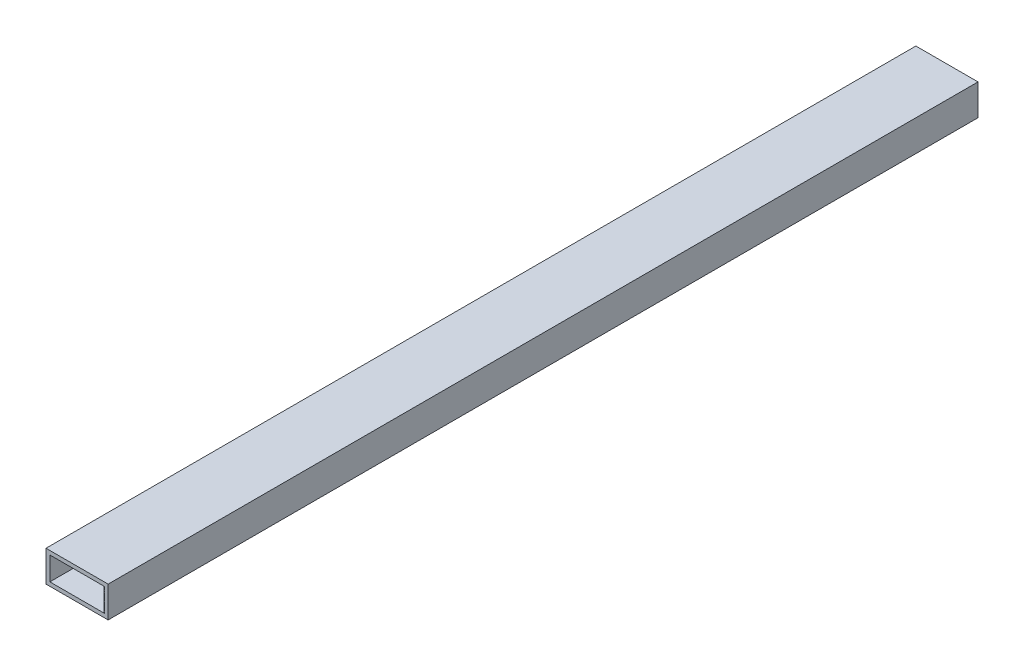
ISO-10303-21;
HEADER;
FILE_DESCRIPTION(('STEP AP214'),'2;1');
FILE_NAME('part.step','',(''),(''),'','','');
FILE_SCHEMA(('AUTOMOTIVE_DESIGN { 1 0 10303 214 1 1 1 1 }'));
ENDSEC;
DATA;
#1=APPLICATION_CONTEXT('core data for automotive mechanical design processes');
#2=APPLICATION_PROTOCOL_DEFINITION('international standard','automotive_design',2000,#1);
#3=PRODUCT_CONTEXT('',#1,'mechanical');
#4=PRODUCT('Part','Part','',(#3));
#5=PRODUCT_RELATED_PRODUCT_CATEGORY('part','',(#4));
#6=PRODUCT_DEFINITION_FORMATION('','',#4);
#7=PRODUCT_DEFINITION_CONTEXT('part definition',#1,'design');
#8=PRODUCT_DEFINITION('design','',#6,#7);
#9=PRODUCT_DEFINITION_SHAPE('','',#8);
#10=(LENGTH_UNIT() NAMED_UNIT(*) SI_UNIT(.MILLI.,.METRE.));
#11=(NAMED_UNIT(*) PLANE_ANGLE_UNIT() SI_UNIT($,.RADIAN.));
#12=(NAMED_UNIT(*) SI_UNIT($,.STERADIAN.) SOLID_ANGLE_UNIT());
#13=UNCERTAINTY_MEASURE_WITH_UNIT(LENGTH_MEASURE(1.E-05),#10,'distance_accuracy_value','');
#14=(GEOMETRIC_REPRESENTATION_CONTEXT(3) GLOBAL_UNCERTAINTY_ASSIGNED_CONTEXT((#13)) GLOBAL_UNIT_ASSIGNED_CONTEXT((#10,
#11,#12)) REPRESENTATION_CONTEXT('',''));
#15=CARTESIAN_POINT('',(0.,0.,0.));
#16=DIRECTION('',(0.,0.,1.));
#17=DIRECTION('',(1.,0.,0.));
#18=AXIS2_PLACEMENT_3D('',#15,#16,#17);
#19=CARTESIAN_POINT('',(25.4,12.7,711.2));
#20=DIRECTION('',(-1.,0.,0.));
#21=DIRECTION('',(0.,0.,1.));
#22=AXIS2_PLACEMENT_3D('',#19,#20,#21);
#23=PLANE('',#22);
#24=DIRECTION('',(0.,1.,0.));
#25=VECTOR('',#24,1.);
#26=CARTESIAN_POINT('',(25.4,12.7,0.));
#27=LINE('',#26,#25);
#28=CARTESIAN_POINT('',(25.4,-12.7,0.));
#29=VERTEX_POINT('',#28);
#30=CARTESIAN_POINT('',(25.4,12.7,0.));
#31=VERTEX_POINT('',#30);
#32=EDGE_CURVE('E145',#29,#31,#27,.T.);
#33=ORIENTED_EDGE('',*,*,#32,.T.);
#34=DIRECTION('',(0.,0.,-1.));
#35=VECTOR('',#34,1.);
#36=CARTESIAN_POINT('',(25.4,12.7,711.2));
#37=LINE('',#36,#35);
#38=CARTESIAN_POINT('',(25.4,12.7,711.2));
#39=VERTEX_POINT('',#38);
#40=EDGE_CURVE('E11',#39,#31,#37,.T.);
#41=ORIENTED_EDGE('',*,*,#40,.F.);
#42=DIRECTION('',(0.,1.,0.));
#43=VECTOR('',#42,1.);
#44=CARTESIAN_POINT('',(25.4,12.7,711.2));
#45=LINE('',#44,#43);
#46=CARTESIAN_POINT('',(25.4,-12.7,711.2));
#47=VERTEX_POINT('',#46);
#48=EDGE_CURVE('E134',#47,#39,#45,.T.);
#49=ORIENTED_EDGE('',*,*,#48,.F.);
#50=DIRECTION('',(0.,0.,-1.));
#51=VECTOR('',#50,1.);
#52=CARTESIAN_POINT('',(25.4,-12.7,711.2));
#53=LINE('',#52,#51);
#54=EDGE_CURVE('E144',#47,#29,#53,.T.);
#55=ORIENTED_EDGE('',*,*,#54,.T.);
#56=EDGE_LOOP('',(#33,#41,#49,#55));
#57=FACE_BOUND('',#56,.T.);
#58=ADVANCED_FACE('F37',(#57),#23,.F.);
#59=CARTESIAN_POINT('',(-25.4,12.7,711.2));
#60=DIRECTION('',(0.,-1.,0.));
#61=DIRECTION('',(0.,0.,-1.));
#62=AXIS2_PLACEMENT_3D('',#59,#60,#61);
#63=PLANE('',#62);
#64=DIRECTION('',(-1.,0.,0.));
#65=VECTOR('',#64,1.);
#66=CARTESIAN_POINT('',(-25.4,12.7,0.));
#67=LINE('',#66,#65);
#68=CARTESIAN_POINT('',(-25.4,12.7,0.));
#69=VERTEX_POINT('',#68);
#70=EDGE_CURVE('E148',#31,#69,#67,.T.);
#71=ORIENTED_EDGE('',*,*,#70,.T.);
#72=DIRECTION('',(0.,0.,-1.));
#73=VECTOR('',#72,1.);
#74=CARTESIAN_POINT('',(-25.4,12.7,711.2));
#75=LINE('',#74,#73);
#76=CARTESIAN_POINT('',(-25.4,12.7,711.2));
#77=VERTEX_POINT('',#76);
#78=EDGE_CURVE('E44',#77,#69,#75,.T.);
#79=ORIENTED_EDGE('',*,*,#78,.F.);
#80=DIRECTION('',(-1.,0.,0.));
#81=VECTOR('',#80,1.);
#82=CARTESIAN_POINT('',(-25.4,12.7,711.2));
#83=LINE('',#82,#81);
#84=EDGE_CURVE('E137',#39,#77,#83,.T.);
#85=ORIENTED_EDGE('',*,*,#84,.F.);
#86=ORIENTED_EDGE('',*,*,#40,.T.);
#87=EDGE_LOOP('',(#71,#79,#85,#86));
#88=FACE_BOUND('',#87,.T.);
#89=ADVANCED_FACE('F176',(#88),#63,.F.);
#90=CARTESIAN_POINT('',(-25.4,12.7,711.2));
#91=DIRECTION('',(1.,0.,0.));
#92=DIRECTION('',(0.,0.,-1.));
#93=AXIS2_PLACEMENT_3D('',#90,#91,#92);
#94=PLANE('',#93);
#95=DIRECTION('',(0.,-1.,0.));
#96=VECTOR('',#95,1.);
#97=CARTESIAN_POINT('',(-25.4,12.7,0.));
#98=LINE('',#97,#96);
#99=CARTESIAN_POINT('',(-25.4,-12.7,0.));
#100=VERTEX_POINT('',#99);
#101=EDGE_CURVE('E150',#69,#100,#98,.T.);
#102=ORIENTED_EDGE('',*,*,#101,.T.);
#103=DIRECTION('',(0.,0.,-1.));
#104=VECTOR('',#103,1.);
#105=CARTESIAN_POINT('',(-25.4,-12.7,711.2));
#106=LINE('',#105,#104);
#107=CARTESIAN_POINT('',(-25.4,-12.7,711.2));
#108=VERTEX_POINT('',#107);
#109=EDGE_CURVE('E155',#108,#100,#106,.T.);
#110=ORIENTED_EDGE('',*,*,#109,.F.);
#111=DIRECTION('',(0.,-1.,0.));
#112=VECTOR('',#111,1.);
#113=CARTESIAN_POINT('',(-25.4,12.7,711.2));
#114=LINE('',#113,#112);
#115=EDGE_CURVE('E140',#77,#108,#114,.T.);
#116=ORIENTED_EDGE('',*,*,#115,.F.);
#117=ORIENTED_EDGE('',*,*,#78,.T.);
#118=EDGE_LOOP('',(#102,#110,#116,#117));
#119=FACE_BOUND('',#118,.T.);
#120=ADVANCED_FACE('F162',(#119),#94,.F.);
#121=CARTESIAN_POINT('',(-25.4,-12.7,711.2));
#122=DIRECTION('',(0.,1.,0.));
#123=DIRECTION('',(0.,0.,1.));
#124=AXIS2_PLACEMENT_3D('',#121,#122,#123);
#125=PLANE('',#124);
#126=DIRECTION('',(1.,0.,0.));
#127=VECTOR('',#126,1.);
#128=CARTESIAN_POINT('',(-25.4,-12.7,0.));
#129=LINE('',#128,#127);
#130=EDGE_CURVE('E138',#100,#29,#129,.T.);
#131=ORIENTED_EDGE('',*,*,#130,.T.);
#132=ORIENTED_EDGE('',*,*,#54,.F.);
#133=DIRECTION('',(1.,0.,0.));
#134=VECTOR('',#133,1.);
#135=CARTESIAN_POINT('',(-25.4,-12.7,711.2));
#136=LINE('',#135,#134);
#137=EDGE_CURVE('E142',#108,#47,#136,.T.);
#138=ORIENTED_EDGE('',*,*,#137,.F.);
#139=ORIENTED_EDGE('',*,*,#109,.T.);
#140=EDGE_LOOP('',(#131,#132,#138,#139));
#141=FACE_BOUND('',#140,.T.);
#142=ADVANCED_FACE('F169',(#141),#125,.F.);
#143=CARTESIAN_POINT('',(0.,0.,711.2));
#144=DIRECTION('',(0.,0.,1.));
#145=DIRECTION('',(1.,0.,0.));
#146=AXIS2_PLACEMENT_3D('',#143,#144,#145);
#147=PLANE('',#146);
#148=DIRECTION('',(0.,1.,0.));
#149=VECTOR('',#148,1.);
#150=CARTESIAN_POINT('',(22.225,12.7,711.2));
#151=LINE('',#150,#149);
#152=CARTESIAN_POINT('',(22.225,-9.525,711.2));
#153=VERTEX_POINT('',#152);
#154=CARTESIAN_POINT('',(22.225,9.525,711.2));
#155=VERTEX_POINT('',#154);
#156=EDGE_CURVE('E122',#153,#155,#151,.T.);
#157=ORIENTED_EDGE('',*,*,#156,.F.);
#158=DIRECTION('',(1.,0.,0.));
#159=VECTOR('',#158,1.);
#160=CARTESIAN_POINT('',(-25.4,-9.525,711.2));
#161=LINE('',#160,#159);
#162=CARTESIAN_POINT('',(-22.225,-9.525,711.2));
#163=VERTEX_POINT('',#162);
#164=EDGE_CURVE('E106',#163,#153,#161,.T.);
#165=ORIENTED_EDGE('',*,*,#164,.F.);
#166=DIRECTION('',(0.,-1.,0.));
#167=VECTOR('',#166,1.);
#168=CARTESIAN_POINT('',(-22.225,12.7,711.2));
#169=LINE('',#168,#167);
#170=CARTESIAN_POINT('',(-22.225,9.525,711.2));
#171=VERTEX_POINT('',#170);
#172=EDGE_CURVE('E131',#171,#163,#169,.T.);
#173=ORIENTED_EDGE('',*,*,#172,.F.);
#174=DIRECTION('',(-1.,0.,0.));
#175=VECTOR('',#174,1.);
#176=CARTESIAN_POINT('',(-25.4,9.525,711.2));
#177=LINE('',#176,#175);
#178=EDGE_CURVE('E124',#155,#171,#177,.T.);
#179=ORIENTED_EDGE('',*,*,#178,.F.);
#180=EDGE_LOOP('',(#157,#165,#173,#179));
#181=FACE_BOUND('',#180,.T.);
#182=ORIENTED_EDGE('',*,*,#48,.T.);
#183=ORIENTED_EDGE('',*,*,#84,.T.);
#184=ORIENTED_EDGE('',*,*,#115,.T.);
#185=ORIENTED_EDGE('',*,*,#137,.T.);
#186=EDGE_LOOP('',(#182,#183,#184,#185));
#187=FACE_BOUND('',#186,.T.);
#188=ADVANCED_FACE('F175',(#181,#187),#147,.T.);
#189=CARTESIAN_POINT('',(0.,0.,0.));
#190=DIRECTION('',(0.,0.,1.));
#191=DIRECTION('',(1.,0.,0.));
#192=AXIS2_PLACEMENT_3D('',#189,#190,#191);
#193=PLANE('',#192);
#194=DIRECTION('',(1.,0.,0.));
#195=VECTOR('',#194,1.);
#196=CARTESIAN_POINT('',(-25.4,-9.525,0.));
#197=LINE('',#196,#195);
#198=CARTESIAN_POINT('',(-22.225,-9.525,0.));
#199=VERTEX_POINT('',#198);
#200=CARTESIAN_POINT('',(22.225,-9.525,0.));
#201=VERTEX_POINT('',#200);
#202=EDGE_CURVE('E104',#199,#201,#197,.T.);
#203=ORIENTED_EDGE('',*,*,#202,.T.);
#204=DIRECTION('',(0.,1.,0.));
#205=VECTOR('',#204,1.);
#206=CARTESIAN_POINT('',(22.225,12.7,0.));
#207=LINE('',#206,#205);
#208=CARTESIAN_POINT('',(22.225,9.525,0.));
#209=VERTEX_POINT('',#208);
#210=EDGE_CURVE('E112',#201,#209,#207,.T.);
#211=ORIENTED_EDGE('',*,*,#210,.T.);
#212=DIRECTION('',(-1.,0.,0.));
#213=VECTOR('',#212,1.);
#214=CARTESIAN_POINT('',(-25.4,9.525,0.));
#215=LINE('',#214,#213);
#216=CARTESIAN_POINT('',(-22.225,9.525,0.));
#217=VERTEX_POINT('',#216);
#218=EDGE_CURVE('E118',#209,#217,#215,.T.);
#219=ORIENTED_EDGE('',*,*,#218,.T.);
#220=DIRECTION('',(0.,-1.,0.));
#221=VECTOR('',#220,1.);
#222=CARTESIAN_POINT('',(-22.225,12.7,0.));
#223=LINE('',#222,#221);
#224=EDGE_CURVE('E58',#217,#199,#223,.T.);
#225=ORIENTED_EDGE('',*,*,#224,.T.);
#226=EDGE_LOOP('',(#203,#211,#219,#225));
#227=FACE_BOUND('',#226,.T.);
#228=ORIENTED_EDGE('',*,*,#32,.F.);
#229=ORIENTED_EDGE('',*,*,#130,.F.);
#230=ORIENTED_EDGE('',*,*,#101,.F.);
#231=ORIENTED_EDGE('',*,*,#70,.F.);
#232=EDGE_LOOP('',(#228,#229,#230,#231));
#233=FACE_BOUND('',#232,.T.);
#234=ADVANCED_FACE('F120',(#227,#233),#193,.F.);
#235=CARTESIAN_POINT('',(22.225,12.7,711.2));
#236=DIRECTION('',(-1.,0.,0.));
#237=DIRECTION('',(0.,0.,1.));
#238=AXIS2_PLACEMENT_3D('',#235,#236,#237);
#239=PLANE('',#238);
#240=ORIENTED_EDGE('',*,*,#210,.F.);
#241=DIRECTION('',(0.,0.,-1.));
#242=VECTOR('',#241,1.);
#243=CARTESIAN_POINT('',(22.225,-9.525,711.2));
#244=LINE('',#243,#242);
#245=EDGE_CURVE('E100',#153,#201,#244,.T.);
#246=ORIENTED_EDGE('',*,*,#245,.F.);
#247=ORIENTED_EDGE('',*,*,#156,.T.);
#248=DIRECTION('',(0.,0.,-1.));
#249=VECTOR('',#248,1.);
#250=CARTESIAN_POINT('',(22.225,9.525,711.2));
#251=LINE('',#250,#249);
#252=EDGE_CURVE('E115',#155,#209,#251,.T.);
#253=ORIENTED_EDGE('',*,*,#252,.T.);
#254=EDGE_LOOP('',(#240,#246,#247,#253));
#255=FACE_BOUND('',#254,.T.);
#256=ADVANCED_FACE('F113',(#255),#239,.T.);
#257=CARTESIAN_POINT('',(-25.4,9.525,711.2));
#258=DIRECTION('',(0.,-1.,0.));
#259=DIRECTION('',(0.,0.,-1.));
#260=AXIS2_PLACEMENT_3D('',#257,#258,#259);
#261=PLANE('',#260);
#262=ORIENTED_EDGE('',*,*,#218,.F.);
#263=ORIENTED_EDGE('',*,*,#252,.F.);
#264=ORIENTED_EDGE('',*,*,#178,.T.);
#265=DIRECTION('',(0.,0.,-1.));
#266=VECTOR('',#265,1.);
#267=CARTESIAN_POINT('',(-22.225,9.525,711.2));
#268=LINE('',#267,#266);
#269=EDGE_CURVE('E280',#171,#217,#268,.T.);
#270=ORIENTED_EDGE('',*,*,#269,.T.);
#271=EDGE_LOOP('',(#262,#263,#264,#270));
#272=FACE_BOUND('',#271,.T.);
#273=ADVANCED_FACE('F196',(#272),#261,.T.);
#274=CARTESIAN_POINT('',(-22.225,12.7,711.2));
#275=DIRECTION('',(1.,0.,0.));
#276=DIRECTION('',(0.,0.,-1.));
#277=AXIS2_PLACEMENT_3D('',#274,#275,#276);
#278=PLANE('',#277);
#279=ORIENTED_EDGE('',*,*,#224,.F.);
#280=ORIENTED_EDGE('',*,*,#269,.F.);
#281=ORIENTED_EDGE('',*,*,#172,.T.);
#282=DIRECTION('',(0.,0.,-1.));
#283=VECTOR('',#282,1.);
#284=CARTESIAN_POINT('',(-22.225,-9.525,711.2));
#285=LINE('',#284,#283);
#286=EDGE_CURVE('E51',#163,#199,#285,.T.);
#287=ORIENTED_EDGE('',*,*,#286,.T.);
#288=EDGE_LOOP('',(#279,#280,#281,#287));
#289=FACE_BOUND('',#288,.T.);
#290=ADVANCED_FACE('F193',(#289),#278,.T.);
#291=CARTESIAN_POINT('',(-25.4,-9.525,711.2));
#292=DIRECTION('',(0.,1.,0.));
#293=DIRECTION('',(0.,0.,1.));
#294=AXIS2_PLACEMENT_3D('',#291,#292,#293);
#295=PLANE('',#294);
#296=ORIENTED_EDGE('',*,*,#202,.F.);
#297=ORIENTED_EDGE('',*,*,#286,.F.);
#298=ORIENTED_EDGE('',*,*,#164,.T.);
#299=ORIENTED_EDGE('',*,*,#245,.T.);
#300=EDGE_LOOP('',(#296,#297,#298,#299));
#301=FACE_BOUND('',#300,.T.);
#302=ADVANCED_FACE('F102',(#301),#295,.T.);
#303=CLOSED_SHELL('',(#58,#89,#120,#142,#188,#234,#256,#273,#290,#302));
#304=MANIFOLD_SOLID_BREP('B2',#303);
#305=ADVANCED_BREP_SHAPE_REPRESENTATION('',(#18,#304),#14);
#306=SHAPE_DEFINITION_REPRESENTATION(#9,#305);
ENDSEC;
END-ISO-10303-21;
